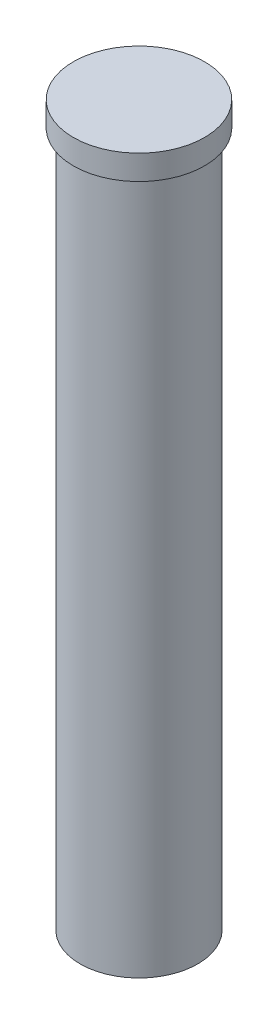
ISO-10303-21;
HEADER;
FILE_DESCRIPTION(('STEP AP214'),'2;1');
FILE_NAME('part.step','',(''),(''),'','','');
FILE_SCHEMA(('AUTOMOTIVE_DESIGN { 1 0 10303 214 1 1 1 1 }'));
ENDSEC;
DATA;
#1=APPLICATION_CONTEXT('core data for automotive mechanical design processes');
#2=APPLICATION_PROTOCOL_DEFINITION('international standard','automotive_design',2000,#1);
#3=PRODUCT_CONTEXT('',#1,'mechanical');
#4=PRODUCT('Part','Part','',(#3));
#5=PRODUCT_RELATED_PRODUCT_CATEGORY('part','',(#4));
#6=PRODUCT_DEFINITION_FORMATION('','',#4);
#7=PRODUCT_DEFINITION_CONTEXT('part definition',#1,'design');
#8=PRODUCT_DEFINITION('design','',#6,#7);
#9=PRODUCT_DEFINITION_SHAPE('','',#8);
#10=(LENGTH_UNIT() NAMED_UNIT(*) SI_UNIT(.MILLI.,.METRE.));
#11=(NAMED_UNIT(*) PLANE_ANGLE_UNIT() SI_UNIT($,.RADIAN.));
#12=(NAMED_UNIT(*) SI_UNIT($,.STERADIAN.) SOLID_ANGLE_UNIT());
#13=UNCERTAINTY_MEASURE_WITH_UNIT(LENGTH_MEASURE(1.E-05),#10,'distance_accuracy_value','');
#14=(GEOMETRIC_REPRESENTATION_CONTEXT(3) GLOBAL_UNCERTAINTY_ASSIGNED_CONTEXT((#13)) GLOBAL_UNIT_ASSIGNED_CONTEXT((#10,
#11,#12)) REPRESENTATION_CONTEXT('',''));
#15=CARTESIAN_POINT('',(0.,0.,0.));
#16=DIRECTION('',(0.,0.,1.));
#17=DIRECTION('',(1.,0.,0.));
#18=AXIS2_PLACEMENT_3D('',#15,#16,#17);
#19=CARTESIAN_POINT('',(0.,26.3,0.));
#20=DIRECTION('',(0.,-1.,0.));
#21=DIRECTION('',(0.,0.,-1.));
#22=AXIS2_PLACEMENT_3D('',#19,#20,#21);
#23=CYLINDRICAL_SURFACE('',#22,2.15);
#24=CARTESIAN_POINT('',(0.,0.,0.));
#25=DIRECTION('',(0.,1.,0.));
#26=DIRECTION('',(0.,0.,1.));
#27=AXIS2_PLACEMENT_3D('',#24,#25,#26);
#28=CIRCLE('',#27,2.15);
#29=CARTESIAN_POINT('',(0.,0.,2.15));
#30=VERTEX_POINT('',#29);
#31=EDGE_CURVE('E37',#30,#30,#28,.T.);
#32=ORIENTED_EDGE('',*,*,#31,.T.);
#33=EDGE_LOOP('',(#32));
#34=FACE_BOUND('',#33,.T.);
#35=CARTESIAN_POINT('',(0.,25.4,0.));
#36=DIRECTION('',(0.,1.,0.));
#37=DIRECTION('',(0.,0.,1.));
#38=AXIS2_PLACEMENT_3D('',#35,#36,#37);
#39=CIRCLE('',#38,2.15);
#40=CARTESIAN_POINT('',(0.,25.4,2.15));
#41=VERTEX_POINT('',#40);
#42=EDGE_CURVE('E10',#41,#41,#39,.T.);
#43=ORIENTED_EDGE('',*,*,#42,.F.);
#44=EDGE_LOOP('',(#43));
#45=FACE_BOUND('',#44,.T.);
#46=ADVANCED_FACE('F31',(#34,#45),#23,.T.);
#47=CARTESIAN_POINT('',(0.,0.,0.));
#48=DIRECTION('',(0.,1.,0.));
#49=DIRECTION('',(0.,0.,1.));
#50=AXIS2_PLACEMENT_3D('',#47,#48,#49);
#51=PLANE('',#50);
#52=ORIENTED_EDGE('',*,*,#31,.F.);
#53=EDGE_LOOP('',(#52));
#54=FACE_BOUND('',#53,.T.);
#55=ADVANCED_FACE('F56',(#54),#51,.F.);
#56=CARTESIAN_POINT('',(0.,25.4,0.));
#57=DIRECTION('',(0.,1.,0.));
#58=DIRECTION('',(0.,0.,1.));
#59=AXIS2_PLACEMENT_3D('',#56,#57,#58);
#60=CYLINDRICAL_SURFACE('',#59,2.4);
#61=CARTESIAN_POINT('',(0.,25.4,0.));
#62=DIRECTION('',(0.,1.,0.));
#63=DIRECTION('',(0.,0.,1.));
#64=AXIS2_PLACEMENT_3D('',#61,#62,#63);
#65=CIRCLE('',#64,2.4);
#66=CARTESIAN_POINT('',(0.,25.4,2.4));
#67=VERTEX_POINT('',#66);
#68=EDGE_CURVE('E41',#67,#67,#65,.T.);
#69=ORIENTED_EDGE('',*,*,#68,.T.);
#70=EDGE_LOOP('',(#69));
#71=FACE_BOUND('',#70,.T.);
#72=CARTESIAN_POINT('',(0.,26.3,0.));
#73=DIRECTION('',(0.,1.,0.));
#74=DIRECTION('',(0.,0.,1.));
#75=AXIS2_PLACEMENT_3D('',#72,#73,#74);
#76=CIRCLE('',#75,2.4);
#77=CARTESIAN_POINT('',(0.,26.3,2.4));
#78=VERTEX_POINT('',#77);
#79=EDGE_CURVE('E45',#78,#78,#76,.T.);
#80=ORIENTED_EDGE('',*,*,#79,.F.);
#81=EDGE_LOOP('',(#80));
#82=FACE_BOUND('',#81,.T.);
#83=ADVANCED_FACE('F53',(#71,#82),#60,.T.);
#84=CARTESIAN_POINT('',(0.,25.4,0.));
#85=DIRECTION('',(0.,1.,0.));
#86=DIRECTION('',(0.,0.,1.));
#87=AXIS2_PLACEMENT_3D('',#84,#85,#86);
#88=PLANE('',#87);
#89=ORIENTED_EDGE('',*,*,#42,.T.);
#90=EDGE_LOOP('',(#89));
#91=FACE_BOUND('',#90,.T.);
#92=ORIENTED_EDGE('',*,*,#68,.F.);
#93=EDGE_LOOP('',(#92));
#94=FACE_BOUND('',#93,.T.);
#95=ADVANCED_FACE('F55',(#91,#94),#88,.F.);
#96=CARTESIAN_POINT('',(0.,26.3,0.));
#97=DIRECTION('',(0.,1.,0.));
#98=DIRECTION('',(0.,0.,1.));
#99=AXIS2_PLACEMENT_3D('',#96,#97,#98);
#100=PLANE('',#99);
#101=ORIENTED_EDGE('',*,*,#79,.T.);
#102=EDGE_LOOP('',(#101));
#103=FACE_BOUND('',#102,.T.);
#104=ADVANCED_FACE('F51',(#103),#100,.T.);
#105=CLOSED_SHELL('',(#46,#55,#83,#95,#104));
#106=MANIFOLD_SOLID_BREP('B2',#105);
#107=ADVANCED_BREP_SHAPE_REPRESENTATION('',(#18,#106),#14);
#108=SHAPE_DEFINITION_REPRESENTATION(#9,#107);
ENDSEC;
END-ISO-10303-21;
